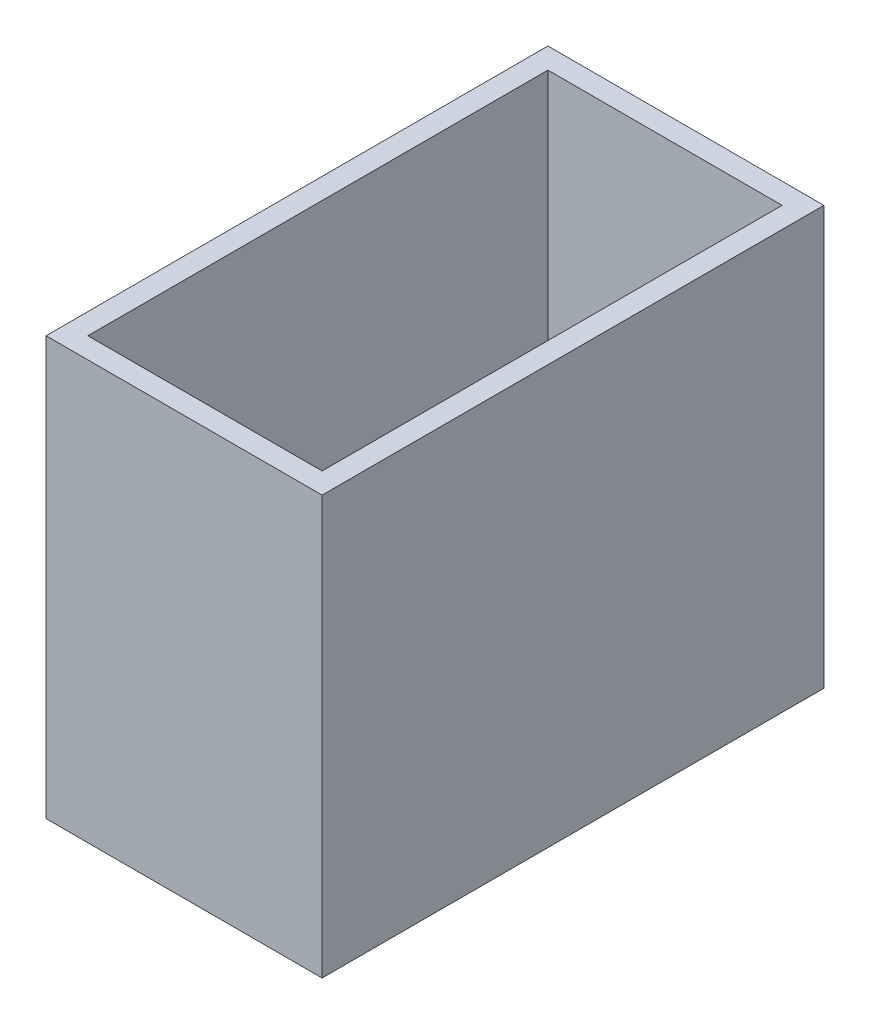
ISO-10303-21;
HEADER;
FILE_DESCRIPTION(('STEP AP214'),'2;1');
FILE_NAME('part.step','',(''),(''),'','','');
FILE_SCHEMA(('AUTOMOTIVE_DESIGN { 1 0 10303 214 1 1 1 1 }'));
ENDSEC;
DATA;
#1=APPLICATION_CONTEXT('core data for automotive mechanical design processes');
#2=APPLICATION_PROTOCOL_DEFINITION('international standard','automotive_design',2000,#1);
#3=PRODUCT_CONTEXT('',#1,'mechanical');
#4=PRODUCT('Part','Part','',(#3));
#5=PRODUCT_RELATED_PRODUCT_CATEGORY('part','',(#4));
#6=PRODUCT_DEFINITION_FORMATION('','',#4);
#7=PRODUCT_DEFINITION_CONTEXT('part definition',#1,'design');
#8=PRODUCT_DEFINITION('design','',#6,#7);
#9=PRODUCT_DEFINITION_SHAPE('','',#8);
#10=(LENGTH_UNIT() NAMED_UNIT(*) SI_UNIT(.MILLI.,.METRE.));
#11=(NAMED_UNIT(*) PLANE_ANGLE_UNIT() SI_UNIT($,.RADIAN.));
#12=(NAMED_UNIT(*) SI_UNIT($,.STERADIAN.) SOLID_ANGLE_UNIT());
#13=UNCERTAINTY_MEASURE_WITH_UNIT(LENGTH_MEASURE(1.E-05),#10,'distance_accuracy_value','');
#14=(GEOMETRIC_REPRESENTATION_CONTEXT(3) GLOBAL_UNCERTAINTY_ASSIGNED_CONTEXT((#13)) GLOBAL_UNIT_ASSIGNED_CONTEXT((#10,
#11,#12)) REPRESENTATION_CONTEXT('',''));
#15=CARTESIAN_POINT('',(0.,0.,0.));
#16=DIRECTION('',(0.,0.,1.));
#17=DIRECTION('',(1.,0.,0.));
#18=AXIS2_PLACEMENT_3D('',#15,#16,#17);
#19=CARTESIAN_POINT('',(0.,63.5,0.));
#20=DIRECTION('',(0.,1.,0.));
#21=DIRECTION('',(0.,0.,1.));
#22=AXIS2_PLACEMENT_3D('',#19,#20,#21);
#23=PLANE('',#22);
#24=DIRECTION('',(0.,0.,1.));
#25=VECTOR('',#24,1.);
#26=CARTESIAN_POINT('',(0.,63.5,76.2));
#27=LINE('',#26,#25);
#28=CARTESIAN_POINT('',(0.,63.5,0.));
#29=VERTEX_POINT('',#28);
#30=CARTESIAN_POINT('',(0.,63.5,76.2));
#31=VERTEX_POINT('',#30);
#32=EDGE_CURVE('E158',#29,#31,#27,.T.);
#33=ORIENTED_EDGE('',*,*,#32,.T.);
#34=DIRECTION('',(1.,0.,0.));
#35=VECTOR('',#34,1.);
#36=CARTESIAN_POINT('',(41.91,63.5,76.2));
#37=LINE('',#36,#35);
#38=CARTESIAN_POINT('',(41.91,63.5,76.2));
#39=VERTEX_POINT('',#38);
#40=EDGE_CURVE('E161',#31,#39,#37,.T.);
#41=ORIENTED_EDGE('',*,*,#40,.T.);
#42=DIRECTION('',(0.,0.,-1.));
#43=VECTOR('',#42,1.);
#44=CARTESIAN_POINT('',(41.91,63.5,0.));
#45=LINE('',#44,#43);
#46=CARTESIAN_POINT('',(41.91,63.5,0.));
#47=VERTEX_POINT('',#46);
#48=EDGE_CURVE('E164',#39,#47,#45,.T.);
#49=ORIENTED_EDGE('',*,*,#48,.T.);
#50=DIRECTION('',(-1.,0.,0.));
#51=VECTOR('',#50,1.);
#52=CARTESIAN_POINT('',(0.,63.5,0.));
#53=LINE('',#52,#51);
#54=EDGE_CURVE('E166',#47,#29,#53,.T.);
#55=ORIENTED_EDGE('',*,*,#54,.T.);
#56=EDGE_LOOP('',(#33,#41,#49,#55));
#57=FACE_BOUND('',#56,.T.);
#58=DIRECTION('',(1.,0.,0.));
#59=VECTOR('',#58,1.);
#60=CARTESIAN_POINT('',(0.,63.5,73.025));
#61=LINE('',#60,#59);
#62=CARTESIAN_POINT('',(3.175,63.5,73.025));
#63=VERTEX_POINT('',#62);
#64=CARTESIAN_POINT('',(38.735,63.5,73.025));
#65=VERTEX_POINT('',#64);
#66=EDGE_CURVE('E130',#63,#65,#61,.T.);
#67=ORIENTED_EDGE('',*,*,#66,.F.);
#68=DIRECTION('',(0.,0.,1.));
#69=VECTOR('',#68,1.);
#70=CARTESIAN_POINT('',(3.175,63.5,0.));
#71=LINE('',#70,#69);
#72=CARTESIAN_POINT('',(3.175,63.5,3.175));
#73=VERTEX_POINT('',#72);
#74=EDGE_CURVE('E122',#73,#63,#71,.T.);
#75=ORIENTED_EDGE('',*,*,#74,.F.);
#76=DIRECTION('',(-1.,0.,0.));
#77=VECTOR('',#76,1.);
#78=CARTESIAN_POINT('',(0.,63.5,3.175));
#79=LINE('',#78,#77);
#80=CARTESIAN_POINT('',(38.735,63.5,3.175));
#81=VERTEX_POINT('',#80);
#82=EDGE_CURVE('E144',#81,#73,#79,.T.);
#83=ORIENTED_EDGE('',*,*,#82,.F.);
#84=DIRECTION('',(0.,0.,-1.));
#85=VECTOR('',#84,1.);
#86=CARTESIAN_POINT('',(38.735,63.5,0.));
#87=LINE('',#86,#85);
#88=EDGE_CURVE('E142',#65,#81,#87,.T.);
#89=ORIENTED_EDGE('',*,*,#88,.F.);
#90=EDGE_LOOP('',(#67,#75,#83,#89));
#91=FACE_BOUND('',#90,.T.);
#92=ADVANCED_FACE('F57',(#57,#91),#23,.T.);
#93=CARTESIAN_POINT('',(0.,0.,0.));
#94=DIRECTION('',(0.,1.,0.));
#95=DIRECTION('',(0.,0.,1.));
#96=AXIS2_PLACEMENT_3D('',#93,#94,#95);
#97=PLANE('',#96);
#98=DIRECTION('',(0.,0.,1.));
#99=VECTOR('',#98,1.);
#100=CARTESIAN_POINT('',(0.,0.,76.2));
#101=LINE('',#100,#99);
#102=CARTESIAN_POINT('',(0.,0.,0.));
#103=VERTEX_POINT('',#102);
#104=CARTESIAN_POINT('',(0.,0.,76.2));
#105=VERTEX_POINT('',#104);
#106=EDGE_CURVE('E138',#103,#105,#101,.T.);
#107=ORIENTED_EDGE('',*,*,#106,.F.);
#108=DIRECTION('',(-1.,0.,0.));
#109=VECTOR('',#108,1.);
#110=CARTESIAN_POINT('',(0.,0.,0.));
#111=LINE('',#110,#109);
#112=CARTESIAN_POINT('',(41.91,0.,0.));
#113=VERTEX_POINT('',#112);
#114=EDGE_CURVE('E162',#113,#103,#111,.T.);
#115=ORIENTED_EDGE('',*,*,#114,.F.);
#116=DIRECTION('',(0.,0.,-1.));
#117=VECTOR('',#116,1.);
#118=CARTESIAN_POINT('',(41.91,0.,0.));
#119=LINE('',#118,#117);
#120=CARTESIAN_POINT('',(41.91,0.,76.2));
#121=VERTEX_POINT('',#120);
#122=EDGE_CURVE('E173',#121,#113,#119,.T.);
#123=ORIENTED_EDGE('',*,*,#122,.F.);
#124=DIRECTION('',(1.,0.,0.));
#125=VECTOR('',#124,1.);
#126=CARTESIAN_POINT('',(41.91,0.,76.2));
#127=LINE('',#126,#125);
#128=EDGE_CURVE('E171',#105,#121,#127,.T.);
#129=ORIENTED_EDGE('',*,*,#128,.F.);
#130=EDGE_LOOP('',(#107,#115,#123,#129));
#131=FACE_BOUND('',#130,.T.);
#132=DIRECTION('',(0.,0.,1.));
#133=VECTOR('',#132,1.);
#134=CARTESIAN_POINT('',(3.175,0.,0.));
#135=LINE('',#134,#133);
#136=CARTESIAN_POINT('',(3.175,0.,3.175));
#137=VERTEX_POINT('',#136);
#138=CARTESIAN_POINT('',(3.175,0.,73.025));
#139=VERTEX_POINT('',#138);
#140=EDGE_CURVE('E80',#137,#139,#135,.T.);
#141=ORIENTED_EDGE('',*,*,#140,.T.);
#142=DIRECTION('',(1.,0.,0.));
#143=VECTOR('',#142,1.);
#144=CARTESIAN_POINT('',(0.,0.,73.025));
#145=LINE('',#144,#143);
#146=CARTESIAN_POINT('',(38.735,0.,73.025));
#147=VERTEX_POINT('',#146);
#148=EDGE_CURVE('E137',#139,#147,#145,.T.);
#149=ORIENTED_EDGE('',*,*,#148,.T.);
#150=DIRECTION('',(0.,0.,-1.));
#151=VECTOR('',#150,1.);
#152=CARTESIAN_POINT('',(38.735,0.,0.));
#153=LINE('',#152,#151);
#154=CARTESIAN_POINT('',(38.735,0.,3.175));
#155=VERTEX_POINT('',#154);
#156=EDGE_CURVE('E150',#147,#155,#153,.T.);
#157=ORIENTED_EDGE('',*,*,#156,.T.);
#158=DIRECTION('',(-1.,0.,0.));
#159=VECTOR('',#158,1.);
#160=CARTESIAN_POINT('',(0.,0.,3.175));
#161=LINE('',#160,#159);
#162=EDGE_CURVE('E131',#155,#137,#161,.T.);
#163=ORIENTED_EDGE('',*,*,#162,.T.);
#164=EDGE_LOOP('',(#141,#149,#157,#163));
#165=FACE_BOUND('',#164,.T.);
#166=ADVANCED_FACE('F191',(#131,#165),#97,.F.);
#167=CARTESIAN_POINT('',(0.,63.5,76.2));
#168=DIRECTION('',(1.,0.,0.));
#169=DIRECTION('',(0.,0.,-1.));
#170=AXIS2_PLACEMENT_3D('',#167,#168,#169);
#171=PLANE('',#170);
#172=ORIENTED_EDGE('',*,*,#106,.T.);
#173=DIRECTION('',(0.,-1.,0.));
#174=VECTOR('',#173,1.);
#175=CARTESIAN_POINT('',(0.,63.5,76.2));
#176=LINE('',#175,#174);
#177=EDGE_CURVE('E12',#31,#105,#176,.T.);
#178=ORIENTED_EDGE('',*,*,#177,.F.);
#179=ORIENTED_EDGE('',*,*,#32,.F.);
#180=DIRECTION('',(0.,-1.,0.));
#181=VECTOR('',#180,1.);
#182=CARTESIAN_POINT('',(0.,63.5,0.));
#183=LINE('',#182,#181);
#184=EDGE_CURVE('E168',#29,#103,#183,.T.);
#185=ORIENTED_EDGE('',*,*,#184,.T.);
#186=EDGE_LOOP('',(#172,#178,#179,#185));
#187=FACE_BOUND('',#186,.T.);
#188=ADVANCED_FACE('F59',(#187),#171,.F.);
#189=CARTESIAN_POINT('',(41.91,63.5,76.2));
#190=DIRECTION('',(0.,0.,-1.));
#191=DIRECTION('',(-1.,0.,0.));
#192=AXIS2_PLACEMENT_3D('',#189,#190,#191);
#193=PLANE('',#192);
#194=ORIENTED_EDGE('',*,*,#128,.T.);
#195=DIRECTION('',(0.,-1.,0.));
#196=VECTOR('',#195,1.);
#197=CARTESIAN_POINT('',(41.91,63.5,76.2));
#198=LINE('',#197,#196);
#199=EDGE_CURVE('E65',#39,#121,#198,.T.);
#200=ORIENTED_EDGE('',*,*,#199,.F.);
#201=ORIENTED_EDGE('',*,*,#40,.F.);
#202=ORIENTED_EDGE('',*,*,#177,.T.);
#203=EDGE_LOOP('',(#194,#200,#201,#202));
#204=FACE_BOUND('',#203,.T.);
#205=ADVANCED_FACE('F201',(#204),#193,.F.);
#206=CARTESIAN_POINT('',(41.91,63.5,0.));
#207=DIRECTION('',(-1.,0.,0.));
#208=DIRECTION('',(0.,0.,1.));
#209=AXIS2_PLACEMENT_3D('',#206,#207,#208);
#210=PLANE('',#209);
#211=ORIENTED_EDGE('',*,*,#122,.T.);
#212=DIRECTION('',(0.,-1.,0.));
#213=VECTOR('',#212,1.);
#214=CARTESIAN_POINT('',(41.91,63.5,0.));
#215=LINE('',#214,#213);
#216=EDGE_CURVE('E178',#47,#113,#215,.T.);
#217=ORIENTED_EDGE('',*,*,#216,.F.);
#218=ORIENTED_EDGE('',*,*,#48,.F.);
#219=ORIENTED_EDGE('',*,*,#199,.T.);
#220=EDGE_LOOP('',(#211,#217,#218,#219));
#221=FACE_BOUND('',#220,.T.);
#222=ADVANCED_FACE('F185',(#221),#210,.F.);
#223=CARTESIAN_POINT('',(0.,63.5,0.));
#224=DIRECTION('',(0.,0.,1.));
#225=DIRECTION('',(1.,0.,0.));
#226=AXIS2_PLACEMENT_3D('',#223,#224,#225);
#227=PLANE('',#226);
#228=ORIENTED_EDGE('',*,*,#114,.T.);
#229=ORIENTED_EDGE('',*,*,#184,.F.);
#230=ORIENTED_EDGE('',*,*,#54,.F.);
#231=ORIENTED_EDGE('',*,*,#216,.T.);
#232=EDGE_LOOP('',(#228,#229,#230,#231));
#233=FACE_BOUND('',#232,.T.);
#234=ADVANCED_FACE('F195',(#233),#227,.F.);
#235=CARTESIAN_POINT('',(3.175,63.5,0.));
#236=DIRECTION('',(1.,0.,0.));
#237=DIRECTION('',(0.,0.,-1.));
#238=AXIS2_PLACEMENT_3D('',#235,#236,#237);
#239=PLANE('',#238);
#240=ORIENTED_EDGE('',*,*,#140,.F.);
#241=DIRECTION('',(0.,-1.,0.));
#242=VECTOR('',#241,1.);
#243=CARTESIAN_POINT('',(3.175,63.5,3.175));
#244=LINE('',#243,#242);
#245=EDGE_CURVE('E126',#73,#137,#244,.T.);
#246=ORIENTED_EDGE('',*,*,#245,.F.);
#247=ORIENTED_EDGE('',*,*,#74,.T.);
#248=DIRECTION('',(0.,-1.,0.));
#249=VECTOR('',#248,1.);
#250=CARTESIAN_POINT('',(3.175,63.5,73.025));
#251=LINE('',#250,#249);
#252=EDGE_CURVE('E125',#63,#139,#251,.T.);
#253=ORIENTED_EDGE('',*,*,#252,.T.);
#254=EDGE_LOOP('',(#240,#246,#247,#253));
#255=FACE_BOUND('',#254,.T.);
#256=ADVANCED_FACE('F124',(#255),#239,.T.);
#257=CARTESIAN_POINT('',(0.,63.5,73.025));
#258=DIRECTION('',(0.,0.,-1.));
#259=DIRECTION('',(-1.,0.,0.));
#260=AXIS2_PLACEMENT_3D('',#257,#258,#259);
#261=PLANE('',#260);
#262=ORIENTED_EDGE('',*,*,#148,.F.);
#263=ORIENTED_EDGE('',*,*,#252,.F.);
#264=ORIENTED_EDGE('',*,*,#66,.T.);
#265=DIRECTION('',(0.,-1.,0.));
#266=VECTOR('',#265,1.);
#267=CARTESIAN_POINT('',(38.735,63.5,73.025));
#268=LINE('',#267,#266);
#269=EDGE_CURVE('E139',#65,#147,#268,.T.);
#270=ORIENTED_EDGE('',*,*,#269,.T.);
#271=EDGE_LOOP('',(#262,#263,#264,#270));
#272=FACE_BOUND('',#271,.T.);
#273=ADVANCED_FACE('F134',(#272),#261,.T.);
#274=CARTESIAN_POINT('',(38.735,63.5,0.));
#275=DIRECTION('',(-1.,0.,0.));
#276=DIRECTION('',(0.,0.,1.));
#277=AXIS2_PLACEMENT_3D('',#274,#275,#276);
#278=PLANE('',#277);
#279=ORIENTED_EDGE('',*,*,#156,.F.);
#280=ORIENTED_EDGE('',*,*,#269,.F.);
#281=ORIENTED_EDGE('',*,*,#88,.T.);
#282=DIRECTION('',(0.,-1.,0.));
#283=VECTOR('',#282,1.);
#284=CARTESIAN_POINT('',(38.735,63.5,3.175));
#285=LINE('',#284,#283);
#286=EDGE_CURVE('E72',#81,#155,#285,.T.);
#287=ORIENTED_EDGE('',*,*,#286,.T.);
#288=EDGE_LOOP('',(#279,#280,#281,#287));
#289=FACE_BOUND('',#288,.T.);
#290=ADVANCED_FACE('F224',(#289),#278,.T.);
#291=CARTESIAN_POINT('',(0.,63.5,3.175));
#292=DIRECTION('',(0.,0.,1.));
#293=DIRECTION('',(1.,0.,0.));
#294=AXIS2_PLACEMENT_3D('',#291,#292,#293);
#295=PLANE('',#294);
#296=ORIENTED_EDGE('',*,*,#162,.F.);
#297=ORIENTED_EDGE('',*,*,#286,.F.);
#298=ORIENTED_EDGE('',*,*,#82,.T.);
#299=ORIENTED_EDGE('',*,*,#245,.T.);
#300=EDGE_LOOP('',(#296,#297,#298,#299));
#301=FACE_BOUND('',#300,.T.);
#302=ADVANCED_FACE('F228',(#301),#295,.T.);
#303=CLOSED_SHELL('',(#92,#166,#188,#205,#222,#234,#256,#273,#290,#302));
#304=MANIFOLD_SOLID_BREP('B2',#303);
#305=ADVANCED_BREP_SHAPE_REPRESENTATION('',(#18,#304),#14);
#306=SHAPE_DEFINITION_REPRESENTATION(#9,#305);
ENDSEC;
END-ISO-10303-21;
